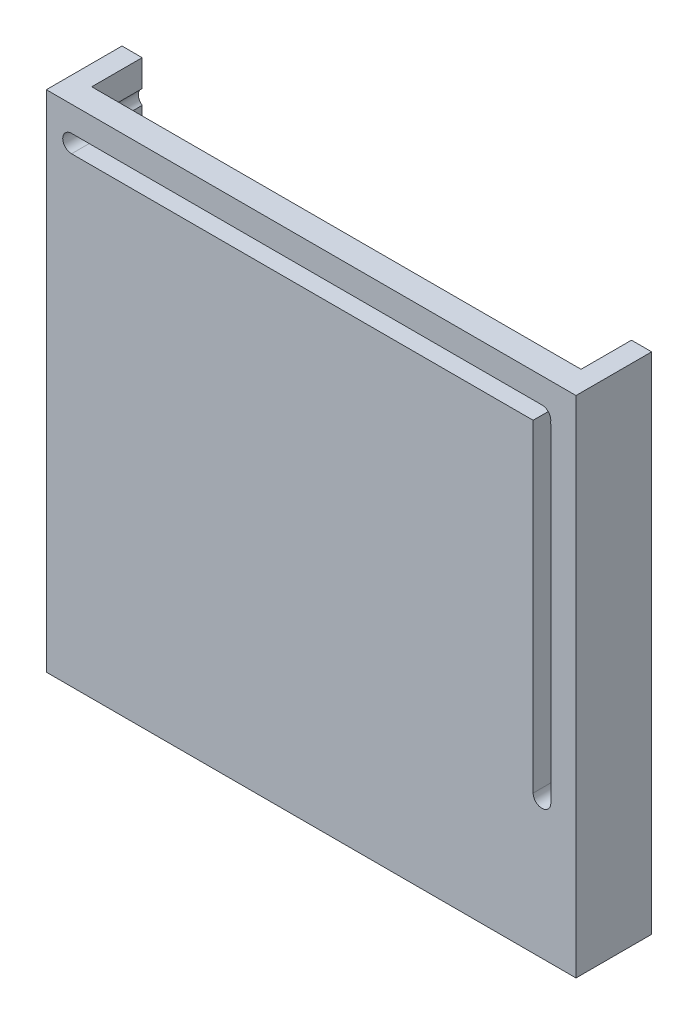
ISO-10303-21;
HEADER;
FILE_DESCRIPTION(('STEP AP214'),'2;1');
FILE_NAME('part.step','',(''),(''),'','','');
FILE_SCHEMA(('AUTOMOTIVE_DESIGN { 1 0 10303 214 1 1 1 1 }'));
ENDSEC;
DATA;
#1=APPLICATION_CONTEXT('core data for automotive mechanical design processes');
#2=APPLICATION_PROTOCOL_DEFINITION('international standard','automotive_design',2000,#1);
#3=PRODUCT_CONTEXT('',#1,'mechanical');
#4=PRODUCT('Part','Part','',(#3));
#5=PRODUCT_RELATED_PRODUCT_CATEGORY('part','',(#4));
#6=PRODUCT_DEFINITION_FORMATION('','',#4);
#7=PRODUCT_DEFINITION_CONTEXT('part definition',#1,'design');
#8=PRODUCT_DEFINITION('design','',#6,#7);
#9=PRODUCT_DEFINITION_SHAPE('','',#8);
#10=(LENGTH_UNIT() NAMED_UNIT(*) SI_UNIT(.MILLI.,.METRE.));
#11=(NAMED_UNIT(*) PLANE_ANGLE_UNIT() SI_UNIT($,.RADIAN.));
#12=(NAMED_UNIT(*) SI_UNIT($,.STERADIAN.) SOLID_ANGLE_UNIT());
#13=UNCERTAINTY_MEASURE_WITH_UNIT(LENGTH_MEASURE(1.E-05),#10,'distance_accuracy_value','');
#14=(GEOMETRIC_REPRESENTATION_CONTEXT(3) GLOBAL_UNCERTAINTY_ASSIGNED_CONTEXT((#13)) GLOBAL_UNIT_ASSIGNED_CONTEXT((#10,
#11,#12)) REPRESENTATION_CONTEXT('',''));
#15=CARTESIAN_POINT('',(0.,0.,0.));
#16=DIRECTION('',(0.,0.,1.));
#17=DIRECTION('',(1.,0.,0.));
#18=AXIS2_PLACEMENT_3D('',#15,#16,#17);
#19=CARTESIAN_POINT('',(-97.,100.,0.));
#20=DIRECTION('',(-1.,0.,0.));
#21=DIRECTION('',(0.,0.,1.));
#22=AXIS2_PLACEMENT_3D('',#19,#20,#21);
#23=PLANE('',#22);
#24=DIRECTION('',(0.,-1.,0.));
#25=VECTOR('',#24,1.);
#26=CARTESIAN_POINT('',(-97.,100.,0.));
#27=LINE('',#26,#25);
#28=CARTESIAN_POINT('',(-97.,83.627718676731,0.));
#29=VERTEX_POINT('',#28);
#30=CARTESIAN_POINT('',(-97.,-100.,0.));
#31=VERTEX_POINT('',#30);
#32=EDGE_CURVE('E250',#29,#31,#27,.T.);
#33=ORIENTED_EDGE('',*,*,#32,.F.);
#34=DIRECTION('',(0.,0.,1.));
#35=VECTOR('',#34,1.);
#36=CARTESIAN_POINT('',(-97.,83.627718676731,0.));
#37=LINE('',#36,#35);
#38=CARTESIAN_POINT('',(-97.,83.627718676731,20.));
#39=VERTEX_POINT('',#38);
#40=EDGE_CURVE('E202',#29,#39,#37,.T.);
#41=ORIENTED_EDGE('',*,*,#40,.T.);
#42=DIRECTION('',(0.,-1.,0.));
#43=VECTOR('',#42,1.);
#44=CARTESIAN_POINT('',(-97.,100.,20.));
#45=LINE('',#44,#43);
#46=CARTESIAN_POINT('',(-97.,-100.,20.));
#47=VERTEX_POINT('',#46);
#48=EDGE_CURVE('E254',#39,#47,#45,.T.);
#49=ORIENTED_EDGE('',*,*,#48,.T.);
#50=DIRECTION('',(0.,0.,-1.));
#51=VECTOR('',#50,1.);
#52=CARTESIAN_POINT('',(-97.,-100.,0.));
#53=LINE('',#52,#51);
#54=EDGE_CURVE('E230',#47,#31,#53,.T.);
#55=ORIENTED_EDGE('',*,*,#54,.T.);
#56=EDGE_LOOP('',(#33,#41,#49,#55));
#57=FACE_BOUND('',#56,.T.);
#58=ADVANCED_FACE('F35',(#57),#23,.F.);
#59=CARTESIAN_POINT('',(0.,0.,0.));
#60=DIRECTION('',(0.,0.,-1.));
#61=DIRECTION('',(-1.,0.,0.));
#62=AXIS2_PLACEMENT_3D('',#59,#60,#61);
#63=PLANE('',#62);
#64=DIRECTION('',(0.,-1.,0.));
#65=VECTOR('',#64,1.);
#66=CARTESIAN_POINT('',(97.,100.,0.));
#67=LINE('',#66,#65);
#68=CARTESIAN_POINT('',(97.,100.,0.));
#69=VERTEX_POINT('',#68);
#70=CARTESIAN_POINT('',(97.,-100.,0.));
#71=VERTEX_POINT('',#70);
#72=EDGE_CURVE('E244',#69,#71,#67,.T.);
#73=ORIENTED_EDGE('',*,*,#72,.F.);
#74=DIRECTION('',(-1.,0.,0.));
#75=VECTOR('',#74,1.);
#76=CARTESIAN_POINT('',(-105.,100.,0.));
#77=LINE('',#76,#75);
#78=CARTESIAN_POINT('',(105.,100.,0.));
#79=VERTEX_POINT('',#78);
#80=EDGE_CURVE('E270',#79,#69,#77,.T.);
#81=ORIENTED_EDGE('',*,*,#80,.F.);
#82=DIRECTION('',(0.,1.,0.));
#83=VECTOR('',#82,1.);
#84=CARTESIAN_POINT('',(105.,-100.,0.));
#85=LINE('',#84,#83);
#86=CARTESIAN_POINT('',(105.,-100.,0.));
#87=VERTEX_POINT('',#86);
#88=EDGE_CURVE('E246',#87,#79,#85,.T.);
#89=ORIENTED_EDGE('',*,*,#88,.F.);
#90=DIRECTION('',(1.,0.,0.));
#91=VECTOR('',#90,1.);
#92=CARTESIAN_POINT('',(-105.,-100.,0.));
#93=LINE('',#92,#91);
#94=EDGE_CURVE('E275',#71,#87,#93,.T.);
#95=ORIENTED_EDGE('',*,*,#94,.F.);
#96=EDGE_LOOP('',(#73,#81,#89,#95));
#97=FACE_BOUND('',#96,.T.);
#98=ADVANCED_FACE('F352',(#97),#63,.T.);
#99=CARTESIAN_POINT('',(105.,-100.,30.));
#100=DIRECTION('',(-1.,0.,0.));
#101=DIRECTION('',(0.,0.,1.));
#102=AXIS2_PLACEMENT_3D('',#99,#100,#101);
#103=PLANE('',#102);
#104=ORIENTED_EDGE('',*,*,#88,.T.);
#105=DIRECTION('',(0.,0.,-1.));
#106=VECTOR('',#105,1.);
#107=CARTESIAN_POINT('',(105.,100.,30.));
#108=LINE('',#107,#106);
#109=CARTESIAN_POINT('',(105.,100.,30.));
#110=VERTEX_POINT('',#109);
#111=EDGE_CURVE('E286',#110,#79,#108,.T.);
#112=ORIENTED_EDGE('',*,*,#111,.F.);
#113=DIRECTION('',(0.,1.,0.));
#114=VECTOR('',#113,1.);
#115=CARTESIAN_POINT('',(105.,-100.,30.));
#116=LINE('',#115,#114);
#117=CARTESIAN_POINT('',(105.,-100.,30.));
#118=VERTEX_POINT('',#117);
#119=EDGE_CURVE('E256',#118,#110,#116,.T.);
#120=ORIENTED_EDGE('',*,*,#119,.F.);
#121=DIRECTION('',(0.,0.,-1.));
#122=VECTOR('',#121,1.);
#123=CARTESIAN_POINT('',(105.,-100.,30.));
#124=LINE('',#123,#122);
#125=EDGE_CURVE('E266',#118,#87,#124,.T.);
#126=ORIENTED_EDGE('',*,*,#125,.T.);
#127=EDGE_LOOP('',(#104,#112,#120,#126));
#128=FACE_BOUND('',#127,.T.);
#129=ADVANCED_FACE('F37',(#128),#103,.F.);
#130=CARTESIAN_POINT('',(-105.,100.,30.));
#131=DIRECTION('',(0.,-1.,0.));
#132=DIRECTION('',(0.,0.,-1.));
#133=AXIS2_PLACEMENT_3D('',#130,#131,#132);
#134=PLANE('',#133);
#135=ORIENTED_EDGE('',*,*,#80,.T.);
#136=DIRECTION('',(0.,0.,1.));
#137=VECTOR('',#136,1.);
#138=CARTESIAN_POINT('',(97.,100.,0.));
#139=LINE('',#138,#137);
#140=CARTESIAN_POINT('',(97.,100.,20.));
#141=VERTEX_POINT('',#140);
#142=EDGE_CURVE('E226',#69,#141,#139,.T.);
#143=ORIENTED_EDGE('',*,*,#142,.T.);
#144=DIRECTION('',(-1.,0.,0.));
#145=VECTOR('',#144,1.);
#146=CARTESIAN_POINT('',(-97.,100.,20.));
#147=LINE('',#146,#145);
#148=CARTESIAN_POINT('',(-97.,100.,20.));
#149=VERTEX_POINT('',#148);
#150=EDGE_CURVE('E229',#141,#149,#147,.T.);
#151=ORIENTED_EDGE('',*,*,#150,.T.);
#152=DIRECTION('',(0.,0.,-1.));
#153=VECTOR('',#152,1.);
#154=CARTESIAN_POINT('',(-97.,100.,0.));
#155=LINE('',#154,#153);
#156=CARTESIAN_POINT('',(-97.,100.,0.));
#157=VERTEX_POINT('',#156);
#158=EDGE_CURVE('E233',#149,#157,#155,.T.);
#159=ORIENTED_EDGE('',*,*,#158,.T.);
#160=CARTESIAN_POINT('',(-105.,100.,0.));
#161=VERTEX_POINT('',#160);
#162=EDGE_CURVE('E269',#157,#161,#77,.T.);
#163=ORIENTED_EDGE('',*,*,#162,.T.);
#164=DIRECTION('',(0.,0.,-1.));
#165=VECTOR('',#164,1.);
#166=CARTESIAN_POINT('',(-105.,100.,30.));
#167=LINE('',#166,#165);
#168=CARTESIAN_POINT('',(-105.,100.,30.));
#169=VERTEX_POINT('',#168);
#170=EDGE_CURVE('E283',#169,#161,#167,.T.);
#171=ORIENTED_EDGE('',*,*,#170,.F.);
#172=DIRECTION('',(-1.,0.,0.));
#173=VECTOR('',#172,1.);
#174=CARTESIAN_POINT('',(-105.,100.,30.));
#175=LINE('',#174,#173);
#176=EDGE_CURVE('E259',#110,#169,#175,.T.);
#177=ORIENTED_EDGE('',*,*,#176,.F.);
#178=ORIENTED_EDGE('',*,*,#111,.T.);
#179=EDGE_LOOP('',(#135,#143,#151,#159,#163,#171,#177,#178));
#180=FACE_BOUND('',#179,.T.);
#181=ADVANCED_FACE('F309',(#180),#134,.F.);
#182=CARTESIAN_POINT('',(-105.,-100.,30.));
#183=DIRECTION('',(1.,0.,0.));
#184=DIRECTION('',(0.,0.,-1.));
#185=AXIS2_PLACEMENT_3D('',#182,#183,#184);
#186=PLANE('',#185);
#187=DIRECTION('',(0.,-1.,0.));
#188=VECTOR('',#187,1.);
#189=CARTESIAN_POINT('',(-105.,-100.,0.));
#190=LINE('',#189,#188);
#191=CARTESIAN_POINT('',(-105.,-100.,0.));
#192=VERTEX_POINT('',#191);
#193=EDGE_CURVE('E273',#161,#192,#190,.T.);
#194=ORIENTED_EDGE('',*,*,#193,.T.);
#195=DIRECTION('',(0.,0.,-1.));
#196=VECTOR('',#195,1.);
#197=CARTESIAN_POINT('',(-105.,-100.,30.));
#198=LINE('',#197,#196);
#199=CARTESIAN_POINT('',(-105.,-100.,30.));
#200=VERTEX_POINT('',#199);
#201=EDGE_CURVE('E280',#200,#192,#198,.T.);
#202=ORIENTED_EDGE('',*,*,#201,.F.);
#203=DIRECTION('',(0.,-1.,0.));
#204=VECTOR('',#203,1.);
#205=CARTESIAN_POINT('',(-105.,-100.,30.));
#206=LINE('',#205,#204);
#207=EDGE_CURVE('E262',#169,#200,#206,.T.);
#208=ORIENTED_EDGE('',*,*,#207,.F.);
#209=ORIENTED_EDGE('',*,*,#170,.T.);
#210=EDGE_LOOP('',(#194,#202,#208,#209));
#211=FACE_BOUND('',#210,.T.);
#212=ADVANCED_FACE('F373',(#211),#186,.F.);
#213=CARTESIAN_POINT('',(-105.,-100.,30.));
#214=DIRECTION('',(0.,1.,0.));
#215=DIRECTION('',(0.,0.,1.));
#216=AXIS2_PLACEMENT_3D('',#213,#214,#215);
#217=PLANE('',#216);
#218=CARTESIAN_POINT('',(14.,-100.,24.544570078092));
#219=DIRECTION('',(0.,-1.,0.));
#220=DIRECTION('',(0.,0.,-1.));
#221=AXIS2_PLACEMENT_3D('',#218,#219,#220);
#222=CIRCLE('',#221,2.5);
#223=CARTESIAN_POINT('',(14.,-100.,22.044570078092));
#224=VERTEX_POINT('',#223);
#225=EDGE_CURVE('E400',#224,#224,#222,.T.);
#226=ORIENTED_EDGE('',*,*,#225,.F.);
#227=EDGE_LOOP('',(#226));
#228=FACE_BOUND('',#227,.T.);
#229=CARTESIAN_POINT('',(-6.00000000000001,-100.,24.544570078092));
#230=DIRECTION('',(0.,-1.,0.));
#231=DIRECTION('',(0.,0.,-1.));
#232=AXIS2_PLACEMENT_3D('',#229,#230,#231);
#233=CIRCLE('',#232,2.5);
#234=CARTESIAN_POINT('',(-6.00000000000001,-100.,22.044570078092));
#235=VERTEX_POINT('',#234);
#236=EDGE_CURVE('E394',#235,#235,#233,.T.);
#237=ORIENTED_EDGE('',*,*,#236,.F.);
#238=EDGE_LOOP('',(#237));
#239=FACE_BOUND('',#238,.T.);
#240=DIRECTION('',(-1.,0.,0.));
#241=VECTOR('',#240,1.);
#242=CARTESIAN_POINT('',(-97.,-100.,20.));
#243=LINE('',#242,#241);
#244=CARTESIAN_POINT('',(97.,-100.,20.));
#245=VERTEX_POINT('',#244);
#246=EDGE_CURVE('E239',#245,#47,#243,.T.);
#247=ORIENTED_EDGE('',*,*,#246,.F.);
#248=DIRECTION('',(0.,0.,1.));
#249=VECTOR('',#248,1.);
#250=CARTESIAN_POINT('',(97.,-100.,0.));
#251=LINE('',#250,#249);
#252=EDGE_CURVE('E221',#71,#245,#251,.T.);
#253=ORIENTED_EDGE('',*,*,#252,.F.);
#254=ORIENTED_EDGE('',*,*,#94,.T.);
#255=ORIENTED_EDGE('',*,*,#125,.F.);
#256=DIRECTION('',(1.,0.,0.));
#257=VECTOR('',#256,1.);
#258=CARTESIAN_POINT('',(-105.,-100.,30.));
#259=LINE('',#258,#257);
#260=EDGE_CURVE('E264',#200,#118,#259,.T.);
#261=ORIENTED_EDGE('',*,*,#260,.F.);
#262=ORIENTED_EDGE('',*,*,#201,.T.);
#263=EDGE_CURVE('E260',#192,#31,#93,.T.);
#264=ORIENTED_EDGE('',*,*,#263,.T.);
#265=ORIENTED_EDGE('',*,*,#54,.F.);
#266=EDGE_LOOP('',(#247,#253,#254,#255,#261,#262,#264,#265));
#267=FACE_BOUND('',#266,.T.);
#268=ADVANCED_FACE('F319',(#228,#239,#267),#217,.F.);
#269=CARTESIAN_POINT('',(0.,0.,30.));
#270=DIRECTION('',(0.,0.,-1.));
#271=DIRECTION('',(-1.,0.,0.));
#272=AXIS2_PLACEMENT_3D('',#269,#270,#271);
#273=PLANE('',#272);
#274=DIRECTION('',(-1.,0.,0.));
#275=VECTOR('',#274,1.);
#276=CARTESIAN_POINT('',(91.5,90.,30.));
#277=LINE('',#276,#275);
#278=CARTESIAN_POINT('',(91.5,90.,30.));
#279=VERTEX_POINT('',#278);
#280=CARTESIAN_POINT('',(-95.,90.,30.));
#281=VERTEX_POINT('',#280);
#282=EDGE_CURVE('E167',#279,#281,#277,.T.);
#283=ORIENTED_EDGE('',*,*,#282,.F.);
#284=CARTESIAN_POINT('',(91.5,86.5,30.));
#285=DIRECTION('',(0.,0.,1.));
#286=DIRECTION('',(1.,0.,0.));
#287=AXIS2_PLACEMENT_3D('',#284,#285,#286);
#288=CIRCLE('',#287,3.5);
#289=CARTESIAN_POINT('',(94.9186985827943,85.75,30.));
#290=VERTEX_POINT('',#289);
#291=EDGE_CURVE('E177',#290,#279,#288,.T.);
#292=ORIENTED_EDGE('',*,*,#291,.F.);
#293=CARTESIAN_POINT('',(91.5,85.,30.));
#294=DIRECTION('',(0.,0.,1.));
#295=DIRECTION('',(1.,0.,0.));
#296=AXIS2_PLACEMENT_3D('',#293,#294,#295);
#297=CIRCLE('',#296,3.50000000000002);
#298=CARTESIAN_POINT('',(95.,85.,30.));
#299=VERTEX_POINT('',#298);
#300=EDGE_CURVE('E208',#299,#290,#297,.T.);
#301=ORIENTED_EDGE('',*,*,#300,.F.);
#302=DIRECTION('',(0.,1.,0.));
#303=VECTOR('',#302,1.);
#304=CARTESIAN_POINT('',(95.,85.,30.));
#305=LINE('',#304,#303);
#306=CARTESIAN_POINT('',(95.,-45.,30.));
#307=VERTEX_POINT('',#306);
#308=EDGE_CURVE('E215',#307,#299,#305,.T.);
#309=ORIENTED_EDGE('',*,*,#308,.F.);
#310=CARTESIAN_POINT('',(91.5,-45.,30.));
#311=DIRECTION('',(0.,0.,1.));
#312=DIRECTION('',(-1.,0.,0.));
#313=AXIS2_PLACEMENT_3D('',#310,#311,#312);
#314=CIRCLE('',#313,3.50000000000002);
#315=CARTESIAN_POINT('',(88.,-45.,30.));
#316=VERTEX_POINT('',#315);
#317=EDGE_CURVE('E212',#316,#307,#314,.T.);
#318=ORIENTED_EDGE('',*,*,#317,.F.);
#319=DIRECTION('',(0.,-1.,0.));
#320=VECTOR('',#319,1.);
#321=CARTESIAN_POINT('',(88.,85.,30.));
#322=LINE('',#321,#320);
#323=CARTESIAN_POINT('',(88.,83.,30.));
#324=VERTEX_POINT('',#323);
#325=EDGE_CURVE('E210',#324,#316,#322,.T.);
#326=ORIENTED_EDGE('',*,*,#325,.F.);
#327=DIRECTION('',(1.,0.,0.));
#328=VECTOR('',#327,1.);
#329=CARTESIAN_POINT('',(91.5,83.,30.));
#330=LINE('',#329,#328);
#331=CARTESIAN_POINT('',(-95.,83.,30.));
#332=VERTEX_POINT('',#331);
#333=EDGE_CURVE('E50',#332,#324,#330,.T.);
#334=ORIENTED_EDGE('',*,*,#333,.F.);
#335=CARTESIAN_POINT('',(-95.,86.5,30.));
#336=DIRECTION('',(0.,0.,1.));
#337=DIRECTION('',(-1.,0.,0.));
#338=AXIS2_PLACEMENT_3D('',#335,#336,#337);
#339=CIRCLE('',#338,3.49999999999999);
#340=EDGE_CURVE('E189',#281,#332,#339,.T.);
#341=ORIENTED_EDGE('',*,*,#340,.F.);
#342=EDGE_LOOP('',(#283,#292,#301,#309,#318,#326,#334,#341));
#343=FACE_BOUND('',#342,.T.);
#344=ORIENTED_EDGE('',*,*,#119,.T.);
#345=ORIENTED_EDGE('',*,*,#176,.T.);
#346=ORIENTED_EDGE('',*,*,#207,.T.);
#347=ORIENTED_EDGE('',*,*,#260,.T.);
#348=EDGE_LOOP('',(#344,#345,#346,#347));
#349=FACE_BOUND('',#348,.T.);
#350=ADVANCED_FACE('F186',(#343,#349),#273,.F.);
#351=CARTESIAN_POINT('',(-95.,86.5,0.));
#352=DIRECTION('',(0.,0.,1.));
#353=DIRECTION('',(-1.,0.,0.));
#354=AXIS2_PLACEMENT_3D('',#351,#352,#353);
#355=CIRCLE('',#354,3.49999999999999);
#356=CARTESIAN_POINT('',(-97.,89.372281323269,0.));
#357=VERTEX_POINT('',#356);
#358=EDGE_CURVE('E174',#357,#29,#355,.T.);
#359=ORIENTED_EDGE('',*,*,#358,.T.);
#360=ORIENTED_EDGE('',*,*,#32,.T.);
#361=ORIENTED_EDGE('',*,*,#263,.F.);
#362=ORIENTED_EDGE('',*,*,#193,.F.);
#363=ORIENTED_EDGE('',*,*,#162,.F.);
#364=EDGE_CURVE('E247',#157,#357,#27,.T.);
#365=ORIENTED_EDGE('',*,*,#364,.T.);
#366=EDGE_LOOP('',(#359,#360,#361,#362,#363,#365));
#367=FACE_BOUND('',#366,.T.);
#368=ADVANCED_FACE('F358',(#367),#63,.T.);
#369=CARTESIAN_POINT('',(97.,100.,0.));
#370=DIRECTION('',(1.,0.,0.));
#371=DIRECTION('',(0.,0.,-1.));
#372=AXIS2_PLACEMENT_3D('',#369,#370,#371);
#373=PLANE('',#372);
#374=ORIENTED_EDGE('',*,*,#252,.T.);
#375=DIRECTION('',(0.,-1.,0.));
#376=VECTOR('',#375,1.);
#377=CARTESIAN_POINT('',(97.,100.,20.));
#378=LINE('',#377,#376);
#379=EDGE_CURVE('E236',#141,#245,#378,.T.);
#380=ORIENTED_EDGE('',*,*,#379,.F.);
#381=ORIENTED_EDGE('',*,*,#142,.F.);
#382=ORIENTED_EDGE('',*,*,#72,.T.);
#383=EDGE_LOOP('',(#374,#380,#381,#382));
#384=FACE_BOUND('',#383,.T.);
#385=ADVANCED_FACE('F315',(#384),#373,.F.);
#386=CARTESIAN_POINT('',(-97.,89.372281323269,20.));
#387=VERTEX_POINT('',#386);
#388=EDGE_CURVE('E251',#149,#387,#45,.T.);
#389=ORIENTED_EDGE('',*,*,#388,.T.);
#390=DIRECTION('',(0.,0.,1.));
#391=VECTOR('',#390,1.);
#392=CARTESIAN_POINT('',(-97.,89.372281323269,0.));
#393=LINE('',#392,#391);
#394=EDGE_CURVE('E205',#387,#357,#393,.F.);
#395=ORIENTED_EDGE('',*,*,#394,.T.);
#396=ORIENTED_EDGE('',*,*,#364,.F.);
#397=ORIENTED_EDGE('',*,*,#158,.F.);
#398=EDGE_LOOP('',(#389,#395,#396,#397));
#399=FACE_BOUND('',#398,.T.);
#400=ADVANCED_FACE('F306',(#399),#23,.F.);
#401=CARTESIAN_POINT('',(-97.,100.,20.));
#402=DIRECTION('',(0.,0.,1.));
#403=DIRECTION('',(1.,0.,0.));
#404=AXIS2_PLACEMENT_3D('',#401,#402,#403);
#405=PLANE('',#404);
#406=CARTESIAN_POINT('',(-95.,86.5,20.));
#407=DIRECTION('',(0.,0.,1.));
#408=DIRECTION('',(1.,0.,0.));
#409=AXIS2_PLACEMENT_3D('',#406,#407,#408);
#410=CIRCLE('',#409,3.49999999999999);
#411=CARTESIAN_POINT('',(-95.,83.,20.));
#412=VERTEX_POINT('',#411);
#413=EDGE_CURVE('E11',#39,#412,#410,.T.);
#414=ORIENTED_EDGE('',*,*,#413,.T.);
#415=DIRECTION('',(1.,0.,0.));
#416=VECTOR('',#415,1.);
#417=CARTESIAN_POINT('',(-97.,83.,20.));
#418=LINE('',#417,#416);
#419=CARTESIAN_POINT('',(88.,83.,20.));
#420=VERTEX_POINT('',#419);
#421=EDGE_CURVE('E197',#412,#420,#418,.T.);
#422=ORIENTED_EDGE('',*,*,#421,.T.);
#423=DIRECTION('',(0.,-1.,0.));
#424=VECTOR('',#423,1.);
#425=CARTESIAN_POINT('',(88.,100.,20.));
#426=LINE('',#425,#424);
#427=CARTESIAN_POINT('',(88.,-45.,20.));
#428=VERTEX_POINT('',#427);
#429=EDGE_CURVE('E58',#420,#428,#426,.T.);
#430=ORIENTED_EDGE('',*,*,#429,.T.);
#431=CARTESIAN_POINT('',(91.5,-45.,20.));
#432=DIRECTION('',(0.,0.,1.));
#433=DIRECTION('',(1.,0.,0.));
#434=AXIS2_PLACEMENT_3D('',#431,#432,#433);
#435=CIRCLE('',#434,3.50000000000002);
#436=CARTESIAN_POINT('',(95.,-45.,20.));
#437=VERTEX_POINT('',#436);
#438=EDGE_CURVE('E290',#428,#437,#435,.T.);
#439=ORIENTED_EDGE('',*,*,#438,.T.);
#440=DIRECTION('',(0.,1.,0.));
#441=VECTOR('',#440,1.);
#442=CARTESIAN_POINT('',(95.,100.,20.));
#443=LINE('',#442,#441);
#444=CARTESIAN_POINT('',(95.,85.,20.));
#445=VERTEX_POINT('',#444);
#446=EDGE_CURVE('E292',#437,#445,#443,.T.);
#447=ORIENTED_EDGE('',*,*,#446,.T.);
#448=CARTESIAN_POINT('',(91.5,85.,20.));
#449=DIRECTION('',(0.,0.,1.));
#450=DIRECTION('',(1.,0.,0.));
#451=AXIS2_PLACEMENT_3D('',#448,#449,#450);
#452=CIRCLE('',#451,3.50000000000002);
#453=CARTESIAN_POINT('',(94.9186985827943,85.75,20.));
#454=VERTEX_POINT('',#453);
#455=EDGE_CURVE('E295',#445,#454,#452,.T.);
#456=ORIENTED_EDGE('',*,*,#455,.T.);
#457=CARTESIAN_POINT('',(91.5,86.5,20.));
#458=DIRECTION('',(0.,0.,1.));
#459=DIRECTION('',(1.,0.,0.));
#460=AXIS2_PLACEMENT_3D('',#457,#458,#459);
#461=CIRCLE('',#460,3.5);
#462=CARTESIAN_POINT('',(91.5,90.,20.));
#463=VERTEX_POINT('',#462);
#464=EDGE_CURVE('E200',#454,#463,#461,.T.);
#465=ORIENTED_EDGE('',*,*,#464,.T.);
#466=DIRECTION('',(-1.,0.,0.));
#467=VECTOR('',#466,1.);
#468=CARTESIAN_POINT('',(-97.,90.,20.));
#469=LINE('',#468,#467);
#470=CARTESIAN_POINT('',(-95.,90.,20.));
#471=VERTEX_POINT('',#470);
#472=EDGE_CURVE('E170',#463,#471,#469,.T.);
#473=ORIENTED_EDGE('',*,*,#472,.T.);
#474=EDGE_CURVE('E39',#471,#387,#410,.T.);
#475=ORIENTED_EDGE('',*,*,#474,.T.);
#476=ORIENTED_EDGE('',*,*,#388,.F.);
#477=ORIENTED_EDGE('',*,*,#150,.F.);
#478=ORIENTED_EDGE('',*,*,#379,.T.);
#479=ORIENTED_EDGE('',*,*,#246,.T.);
#480=ORIENTED_EDGE('',*,*,#48,.F.);
#481=EDGE_LOOP('',(#414,#422,#430,#439,#447,#456,#465,#473,#475,#476,#477,#478,#479,#480));
#482=FACE_BOUND('',#481,.T.);
#483=ADVANCED_FACE('F301',(#482),#405,.F.);
#484=CARTESIAN_POINT('',(91.5,85.,0.));
#485=DIRECTION('',(0.,0.,1.));
#486=DIRECTION('',(1.,0.,0.));
#487=AXIS2_PLACEMENT_3D('',#484,#485,#486);
#488=CYLINDRICAL_SURFACE('',#487,3.50000000000002);
#489=ORIENTED_EDGE('',*,*,#300,.T.);
#490=DIRECTION('',(0.,0.,1.));
#491=VECTOR('',#490,1.);
#492=CARTESIAN_POINT('',(94.9186985827943,85.75,15.));
#493=LINE('',#492,#491);
#494=EDGE_CURVE('E180',#290,#454,#493,.F.);
#495=ORIENTED_EDGE('',*,*,#494,.T.);
#496=ORIENTED_EDGE('',*,*,#455,.F.);
#497=DIRECTION('',(0.,0.,1.));
#498=VECTOR('',#497,1.);
#499=CARTESIAN_POINT('',(95.,85.,0.));
#500=LINE('',#499,#498);
#501=EDGE_CURVE('E219',#445,#299,#500,.T.);
#502=ORIENTED_EDGE('',*,*,#501,.T.);
#503=EDGE_LOOP('',(#489,#495,#496,#502));
#504=FACE_BOUND('',#503,.T.);
#505=ADVANCED_FACE('F340',(#504),#488,.F.);
#506=CARTESIAN_POINT('',(95.,85.,0.));
#507=DIRECTION('',(1.,0.,0.));
#508=DIRECTION('',(0.,1.,0.));
#509=AXIS2_PLACEMENT_3D('',#506,#507,#508);
#510=PLANE('',#509);
#511=DIRECTION('',(0.,0.,1.));
#512=VECTOR('',#511,1.);
#513=CARTESIAN_POINT('',(95.,-45.,0.));
#514=LINE('',#513,#512);
#515=EDGE_CURVE('E222',#437,#307,#514,.T.);
#516=ORIENTED_EDGE('',*,*,#515,.T.);
#517=ORIENTED_EDGE('',*,*,#308,.T.);
#518=ORIENTED_EDGE('',*,*,#501,.F.);
#519=ORIENTED_EDGE('',*,*,#446,.F.);
#520=EDGE_LOOP('',(#516,#517,#518,#519));
#521=FACE_BOUND('',#520,.T.);
#522=ADVANCED_FACE('F338',(#521),#510,.F.);
#523=CARTESIAN_POINT('',(91.5,-45.,0.));
#524=DIRECTION('',(0.,0.,1.));
#525=DIRECTION('',(1.,0.,0.));
#526=AXIS2_PLACEMENT_3D('',#523,#524,#525);
#527=CYLINDRICAL_SURFACE('',#526,3.50000000000002);
#528=DIRECTION('',(0.,0.,1.));
#529=VECTOR('',#528,1.);
#530=CARTESIAN_POINT('',(88.,-45.,0.));
#531=LINE('',#530,#529);
#532=EDGE_CURVE('E218',#428,#316,#531,.T.);
#533=ORIENTED_EDGE('',*,*,#532,.T.);
#534=ORIENTED_EDGE('',*,*,#317,.T.);
#535=ORIENTED_EDGE('',*,*,#515,.F.);
#536=ORIENTED_EDGE('',*,*,#438,.F.);
#537=EDGE_LOOP('',(#533,#534,#535,#536));
#538=FACE_BOUND('',#537,.T.);
#539=ADVANCED_FACE('F334',(#538),#527,.F.);
#540=CARTESIAN_POINT('',(88.,85.,0.));
#541=DIRECTION('',(-1.,0.,0.));
#542=DIRECTION('',(0.,-1.,0.));
#543=AXIS2_PLACEMENT_3D('',#540,#541,#542);
#544=PLANE('',#543);
#545=ORIENTED_EDGE('',*,*,#429,.F.);
#546=DIRECTION('',(0.,0.,1.));
#547=VECTOR('',#546,1.);
#548=CARTESIAN_POINT('',(88.,83.,0.));
#549=LINE('',#548,#547);
#550=EDGE_CURVE('E298',#420,#324,#549,.T.);
#551=ORIENTED_EDGE('',*,*,#550,.T.);
#552=ORIENTED_EDGE('',*,*,#325,.T.);
#553=ORIENTED_EDGE('',*,*,#532,.F.);
#554=EDGE_LOOP('',(#545,#551,#552,#553));
#555=FACE_BOUND('',#554,.T.);
#556=ADVANCED_FACE('F329',(#555),#544,.F.);
#557=CARTESIAN_POINT('',(-95.,86.5,0.));
#558=DIRECTION('',(0.,0.,1.));
#559=DIRECTION('',(1.,0.,0.));
#560=AXIS2_PLACEMENT_3D('',#557,#558,#559);
#561=CYLINDRICAL_SURFACE('',#560,3.49999999999999);
#562=ORIENTED_EDGE('',*,*,#474,.F.);
#563=DIRECTION('',(0.,0.,1.));
#564=VECTOR('',#563,1.);
#565=CARTESIAN_POINT('',(-95.,90.,0.));
#566=LINE('',#565,#564);
#567=EDGE_CURVE('E173',#471,#281,#566,.T.);
#568=ORIENTED_EDGE('',*,*,#567,.T.);
#569=ORIENTED_EDGE('',*,*,#340,.T.);
#570=DIRECTION('',(0.,0.,1.));
#571=VECTOR('',#570,1.);
#572=CARTESIAN_POINT('',(-95.,83.,0.));
#573=LINE('',#572,#571);
#574=EDGE_CURVE('E195',#412,#332,#573,.T.);
#575=ORIENTED_EDGE('',*,*,#574,.F.);
#576=ORIENTED_EDGE('',*,*,#413,.F.);
#577=ORIENTED_EDGE('',*,*,#40,.F.);
#578=ORIENTED_EDGE('',*,*,#358,.F.);
#579=ORIENTED_EDGE('',*,*,#394,.F.);
#580=EDGE_LOOP('',(#562,#568,#569,#575,#576,#577,#578,#579));
#581=FACE_BOUND('',#580,.T.);
#582=ADVANCED_FACE('F324',(#581),#561,.F.);
#583=CARTESIAN_POINT('',(91.5,90.,0.));
#584=DIRECTION('',(0.,1.,0.));
#585=DIRECTION('',(-1.,0.,0.));
#586=AXIS2_PLACEMENT_3D('',#583,#584,#585);
#587=PLANE('',#586);
#588=DIRECTION('',(0.,0.,1.));
#589=VECTOR('',#588,1.);
#590=CARTESIAN_POINT('',(91.5,90.,0.));
#591=LINE('',#590,#589);
#592=EDGE_CURVE('E162',#463,#279,#591,.T.);
#593=ORIENTED_EDGE('',*,*,#592,.T.);
#594=ORIENTED_EDGE('',*,*,#282,.T.);
#595=ORIENTED_EDGE('',*,*,#567,.F.);
#596=ORIENTED_EDGE('',*,*,#472,.F.);
#597=EDGE_LOOP('',(#593,#594,#595,#596));
#598=FACE_BOUND('',#597,.T.);
#599=ADVANCED_FACE('F164',(#598),#587,.F.);
#600=CARTESIAN_POINT('',(91.5,86.5,0.));
#601=DIRECTION('',(0.,0.,1.));
#602=DIRECTION('',(1.,0.,0.));
#603=AXIS2_PLACEMENT_3D('',#600,#601,#602);
#604=CYLINDRICAL_SURFACE('',#603,3.5);
#605=ORIENTED_EDGE('',*,*,#494,.F.);
#606=ORIENTED_EDGE('',*,*,#291,.T.);
#607=ORIENTED_EDGE('',*,*,#592,.F.);
#608=ORIENTED_EDGE('',*,*,#464,.F.);
#609=EDGE_LOOP('',(#605,#606,#607,#608));
#610=FACE_BOUND('',#609,.T.);
#611=ADVANCED_FACE('F178',(#610),#604,.F.);
#612=CARTESIAN_POINT('',(91.5,83.,0.));
#613=DIRECTION('',(0.,-1.,0.));
#614=DIRECTION('',(0.,0.,-1.));
#615=AXIS2_PLACEMENT_3D('',#612,#613,#614);
#616=PLANE('',#615);
#617=ORIENTED_EDGE('',*,*,#574,.T.);
#618=ORIENTED_EDGE('',*,*,#333,.T.);
#619=ORIENTED_EDGE('',*,*,#550,.F.);
#620=ORIENTED_EDGE('',*,*,#421,.F.);
#621=EDGE_LOOP('',(#617,#618,#619,#620));
#622=FACE_BOUND('',#621,.T.);
#623=ADVANCED_FACE('F326',(#622),#616,.F.);
#624=CARTESIAN_POINT('',(-6.00000000000001,-90.,24.544570078092));
#625=DIRECTION('',(0.,-1.,0.));
#626=DIRECTION('',(0.,0.,-1.));
#627=AXIS2_PLACEMENT_3D('',#624,#625,#626);
#628=CYLINDRICAL_SURFACE('',#627,2.5);
#629=CARTESIAN_POINT('',(-6.00000000000001,-90.,24.544570078092));
#630=DIRECTION('',(0.,-1.,0.));
#631=DIRECTION('',(0.,0.,-1.));
#632=AXIS2_PLACEMENT_3D('',#629,#630,#631);
#633=CIRCLE('',#632,2.5);
#634=CARTESIAN_POINT('',(-6.00000000000001,-90.,22.044570078092));
#635=VERTEX_POINT('',#634);
#636=EDGE_CURVE('E184',#635,#635,#633,.T.);
#637=ORIENTED_EDGE('',*,*,#636,.F.);
#638=EDGE_LOOP('',(#637));
#639=FACE_BOUND('',#638,.T.);
#640=ORIENTED_EDGE('',*,*,#236,.T.);
#641=EDGE_LOOP('',(#640));
#642=FACE_BOUND('',#641,.T.);
#643=ADVANCED_FACE('F417',(#639,#642),#628,.F.);
#644=CARTESIAN_POINT('',(-6.00000000000001,-90.,24.544570078092));
#645=DIRECTION('',(0.,-1.,0.));
#646=DIRECTION('',(0.,0.,-1.));
#647=AXIS2_PLACEMENT_3D('',#644,#645,#646);
#648=PLANE('',#647);
#649=ORIENTED_EDGE('',*,*,#636,.T.);
#650=EDGE_LOOP('',(#649));
#651=FACE_BOUND('',#650,.T.);
#652=ADVANCED_FACE('F411',(#651),#648,.T.);
#653=CARTESIAN_POINT('',(14.,-90.,24.544570078092));
#654=DIRECTION('',(0.,-1.,0.));
#655=DIRECTION('',(0.,0.,-1.));
#656=AXIS2_PLACEMENT_3D('',#653,#654,#655);
#657=CYLINDRICAL_SURFACE('',#656,2.5);
#658=CARTESIAN_POINT('',(14.,-90.,24.544570078092));
#659=DIRECTION('',(0.,-1.,0.));
#660=DIRECTION('',(0.,0.,-1.));
#661=AXIS2_PLACEMENT_3D('',#658,#659,#660);
#662=CIRCLE('',#661,2.5);
#663=CARTESIAN_POINT('',(14.,-90.,22.044570078092));
#664=VERTEX_POINT('',#663);
#665=EDGE_CURVE('E397',#664,#664,#662,.T.);
#666=ORIENTED_EDGE('',*,*,#665,.F.);
#667=EDGE_LOOP('',(#666));
#668=FACE_BOUND('',#667,.T.);
#669=ORIENTED_EDGE('',*,*,#225,.T.);
#670=EDGE_LOOP('',(#669));
#671=FACE_BOUND('',#670,.T.);
#672=ADVANCED_FACE('F408',(#668,#671),#657,.F.);
#673=CARTESIAN_POINT('',(14.,-90.,24.544570078092));
#674=DIRECTION('',(0.,-1.,0.));
#675=DIRECTION('',(0.,0.,-1.));
#676=AXIS2_PLACEMENT_3D('',#673,#674,#675);
#677=PLANE('',#676);
#678=ORIENTED_EDGE('',*,*,#665,.T.);
#679=EDGE_LOOP('',(#678));
#680=FACE_BOUND('',#679,.T.);
#681=ADVANCED_FACE('F406',(#680),#677,.T.);
#682=CLOSED_SHELL('',(#58,#98,#129,#181,#212,#268,#350,#368,#385,#400,#483,#505,#522,#539,#556,
#582,#599,#611,#623,#643,#652,#672,#681));
#683=MANIFOLD_SOLID_BREP('B2',#682);
#684=ADVANCED_BREP_SHAPE_REPRESENTATION('',(#18,#683),#14);
#685=SHAPE_DEFINITION_REPRESENTATION(#9,#684);
ENDSEC;
END-ISO-10303-21;
